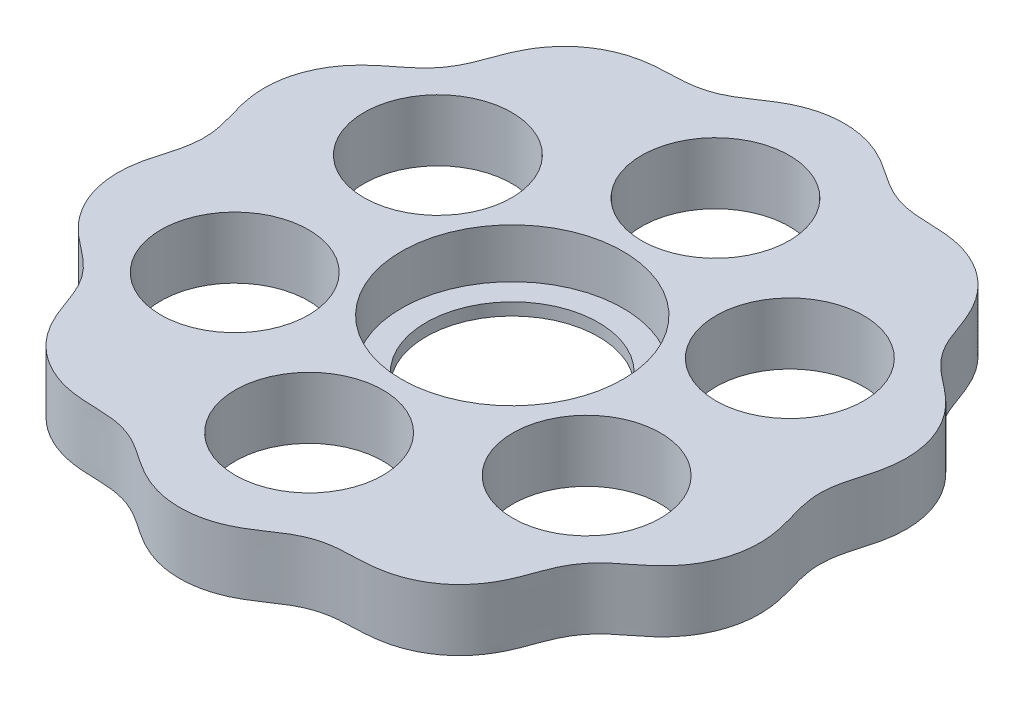
ISO-10303-21;
HEADER;
FILE_DESCRIPTION(('STEP AP214'),'2;1');
FILE_NAME('part.step','',(''),(''),'','','');
FILE_SCHEMA(('AUTOMOTIVE_DESIGN { 1 0 10303 214 1 1 1 1 }'));
ENDSEC;
DATA;
#1=APPLICATION_CONTEXT('core data for automotive mechanical design processes');
#2=APPLICATION_PROTOCOL_DEFINITION('international standard','automotive_design',2000,#1);
#3=PRODUCT_CONTEXT('',#1,'mechanical');
#4=PRODUCT('Part','Part','',(#3));
#5=PRODUCT_RELATED_PRODUCT_CATEGORY('part','',(#4));
#6=PRODUCT_DEFINITION_FORMATION('','',#4);
#7=PRODUCT_DEFINITION_CONTEXT('part definition',#1,'design');
#8=PRODUCT_DEFINITION('design','',#6,#7);
#9=PRODUCT_DEFINITION_SHAPE('','',#8);
#10=(LENGTH_UNIT() NAMED_UNIT(*) SI_UNIT(.MILLI.,.METRE.));
#11=(NAMED_UNIT(*) PLANE_ANGLE_UNIT() SI_UNIT($,.RADIAN.));
#12=(NAMED_UNIT(*) SI_UNIT($,.STERADIAN.) SOLID_ANGLE_UNIT());
#13=UNCERTAINTY_MEASURE_WITH_UNIT(LENGTH_MEASURE(1.E-05),#10,'distance_accuracy_value','');
#14=(GEOMETRIC_REPRESENTATION_CONTEXT(3) GLOBAL_UNCERTAINTY_ASSIGNED_CONTEXT((#13)) GLOBAL_UNIT_ASSIGNED_CONTEXT((#10,
#11,#12)) REPRESENTATION_CONTEXT('',''));
#15=CARTESIAN_POINT('',(0.,0.,0.));
#16=DIRECTION('',(0.,0.,1.));
#17=DIRECTION('',(1.,0.,0.));
#18=AXIS2_PLACEMENT_3D('',#15,#16,#17);
#19=CARTESIAN_POINT('',(25.0000043932119,5.,0.00688755630900068));
#20=CARTESIAN_POINT('',(25.0000079298728,5.,-0.0251789221813694));
#21=CARTESIAN_POINT('',(25.0006122124393,5.,-0.0894836878834096));
#22=CARTESIAN_POINT('',(25.0033137705583,5.,-0.21931083896127));
#23=CARTESIAN_POINT('',(25.0104733346177,5.,-0.378294162704438));
#24=CARTESIAN_POINT('',(25.023811139123,5.,-0.564866036945412));
#25=CARTESIAN_POINT('',(25.0466990496331,5.,-0.794074306736719));
#26=CARTESIAN_POINT('',(25.0830251590425,5.,-1.05906675390636));
#27=CARTESIAN_POINT('',(25.1366085348914,5.,-1.36011035681514));
#28=CARTESIAN_POINT('',(25.2007589711714,5.,-1.65913190132036));
#29=CARTESIAN_POINT('',(25.2736274349604,5.,-1.95606252800234));
#30=CARTESIAN_POINT('',(25.3578991143379,5.,-2.2693294773103));
#31=CARTESIAN_POINT('',(25.4520927934586,5.,-2.59913781536133));
#32=CARTESIAN_POINT('',(25.5799478649812,5.,-3.03757929360862));
#33=CARTESIAN_POINT('',(25.7089005682602,5.,-3.49511046296013));
#34=CARTESIAN_POINT('',(25.8233776615371,5.,-3.95665693120054));
#35=CARTESIAN_POINT('',(25.9354010299198,5.,-4.51608980350711));
#36=CARTESIAN_POINT('',(26.027439815781,5.,-5.14435756018011));
#37=CARTESIAN_POINT('',(26.076379782276,5.,-5.9382052774394));
#38=CARTESIAN_POINT('',(26.0229986373087,5.,-6.8924614789132));
#39=CARTESIAN_POINT('',(25.8327251169261,5.,-7.89472626132632));
#40=CARTESIAN_POINT('',(25.5115141079369,5.,-8.86304271895348));
#41=CARTESIAN_POINT('',(25.06501937879,5.,-9.78033108892347));
#42=CARTESIAN_POINT('',(24.52922665595,5.,-10.5901381652924));
#43=CARTESIAN_POINT('',(23.9328701508746,5.,-11.2923048087122));
#44=CARTESIAN_POINT('',(23.3042543809618,5.,-11.8958184569734));
#45=CARTESIAN_POINT('',(22.6697127632783,5.,-12.4183654838858));
#46=CARTESIAN_POINT('',(21.9507379783981,5.,-12.9659659988632));
#47=CARTESIAN_POINT('',(21.1795420958765,5.,-13.582577927403));
#48=CARTESIAN_POINT('',(20.3998279796656,5.,-14.3718541846484));
#49=CARTESIAN_POINT('',(19.7128923872484,5.,-15.3942954358269));
#50=CARTESIAN_POINT('',(19.1993715784081,5.,-16.5908852071694));
#51=CARTESIAN_POINT('',(18.7729722705069,5.,-17.8940312763662));
#52=CARTESIAN_POINT('',(18.1544684914808,5.,-19.3287567718172));
#53=CARTESIAN_POINT('',(17.1621794978166,5.,-20.7781573686578));
#54=CARTESIAN_POINT('',(15.7398390747472,5.,-22.0537516807593));
#55=CARTESIAN_POINT('',(14.166462825447,5.,-22.844224421919));
#56=CARTESIAN_POINT('',(12.7589848053442,5.,-23.2082945296998));
#57=CARTESIAN_POINT('',(11.6138654734049,5.,-23.3385309745854));
#58=CARTESIAN_POINT('',(10.7567981278104,5.,-23.3756646006657));
#59=CARTESIAN_POINT('',(9.84470001520157,5.,-23.3952060675215));
#60=CARTESIAN_POINT('',(8.87640804124759,5.,-23.4654385554486));
#61=CARTESIAN_POINT('',(7.77413068148992,5.,-23.691296055995));
#62=CARTESIAN_POINT('',(6.58733782639492,5.,-24.1819056906618));
#63=CARTESIAN_POINT('',(5.4707263460462,5.,-24.9196562346342));
#64=CARTESIAN_POINT('',(4.32883491321425,5.,-25.7245812925356));
#65=CARTESIAN_POINT('',(2.96464242008512,5.,-26.4507773450072));
#66=CARTESIAN_POINT('',(1.34690113740759,5.,-26.9526124886537));
#67=CARTESIAN_POINT('',(-0.529285396878028,5.,-27.0754503216001));
#68=CARTESIAN_POINT('',(-2.26247300825678,5.,-26.7246345850446));
#69=CARTESIAN_POINT('',(-3.60887890237826,5.,-26.1359390006047));
#70=CARTESIAN_POINT('',(-4.6137985842746,5.,-25.5258520456705));
#71=CARTESIAN_POINT('',(-5.34657526927802,5.,-25.0225056025051));
#72=CARTESIAN_POINT('',(-6.10855689305063,5.,-24.5060675721032));
#73=CARTESIAN_POINT('',(-6.94165519422261,5.,-24.037235359892));
#74=CARTESIAN_POINT('',(-7.99637903104393,5.,-23.6253306751136));
#75=CARTESIAN_POINT('',(-9.2881186621647,5.,-23.3871370814688));
#76=CARTESIAN_POINT('',(-10.6391705996122,5.,-23.3788682235266));
#77=CARTESIAN_POINT('',(-12.0367464501957,5.,-23.3156126748665));
#78=CARTESIAN_POINT('',(-13.5248730894135,5.,-23.0344523114824));
#79=CARTESIAN_POINT('',(-15.0463068951974,5.,-22.4448849132248));
#80=CARTESIAN_POINT('',(-16.5727332528975,5.,-21.400707194298));
#81=CARTESIAN_POINT('',(-17.8568330791975,5.,-19.8932545907739));
#82=CARTESIAN_POINT('',(-18.6989716168686,5.,-18.1945679186019));
#83=CARTESIAN_POINT('',(-19.1782318292762,5.,-16.6412968228826));
#84=CARTESIAN_POINT('',(-19.7262943259612,5.,-15.3760504107801));
#85=CARTESIAN_POINT('',(-20.4956197228332,5.,-14.2515956559399));
#86=CARTESIAN_POINT('',(-21.4539259408882,5.,-13.3044241102046));
#87=CARTESIAN_POINT('',(-22.5689001533263,5.,-12.5101623585405));
#88=CARTESIAN_POINT('',(-23.6404410661688,5.,-11.6087173178391));
#89=CARTESIAN_POINT('',(-24.6331361042316,5.,-10.4893617517088));
#90=CARTESIAN_POINT('',(-25.461092958498,5.,-9.12568495282608));
#91=CARTESIAN_POINT('',(-25.9545658313099,5.,-7.63087588252002));
#92=CARTESIAN_POINT('',(-26.1035053905357,5.,-6.10243469519284));
#93=CARTESIAN_POINT('',(-26.0122948948656,5.,-4.86952175427012));
#94=CARTESIAN_POINT('',(-25.8390620120504,5.,-3.9439520387487));
#95=CARTESIAN_POINT('',(-25.602654324425,5.,-3.07321832146391));
#96=CARTESIAN_POINT('',(-25.3527793271515,5.,-2.2470257291514));
#97=CARTESIAN_POINT('',(-25.1263181980435,5.,-1.37324821595767));
#98=CARTESIAN_POINT('',(-24.9868213370367,5.,-0.440454633070864));
#99=CARTESIAN_POINT('',(-24.9866946504391,5.,0.504309026434094));
#100=CARTESIAN_POINT('',(-25.1258818731271,5.,1.43714311047385));
#101=CARTESIAN_POINT('',(-25.3518907174907,5.,2.31103225307368));
#102=CARTESIAN_POINT('',(-25.6011161912943,5.,3.13742016008203));
#103=CARTESIAN_POINT('',(-25.8366342263414,5.,4.00839949319347));
#104=CARTESIAN_POINT('',(-26.0087985909375,5.,4.93416915368055));
#105=CARTESIAN_POINT('',(-26.0985167645958,5.,6.16719535175371));
#106=CARTESIAN_POINT('',(-25.9476888196573,5.,7.69544822216899));
#107=CARTESIAN_POINT('',(-25.452367735392,5.,9.1896511371411));
#108=CARTESIAN_POINT('',(-24.6227276155765,5.,10.5522955795275));
#109=CARTESIAN_POINT('',(-23.6286871547157,5.,11.6704637549174));
#110=CARTESIAN_POINT('',(-22.5561510845411,5.,12.5706830127468));
#111=CARTESIAN_POINT('',(-21.440599400345,5.,13.3641694997834));
#112=CARTESIAN_POINT('',(-20.481997665973,5.,14.3110671388792));
#113=CARTESIAN_POINT('',(-19.7123497830667,5.,15.4353023159605));
#114=CARTESIAN_POINT('',(-19.1638518787643,5.,16.7003253958562));
#115=CARTESIAN_POINT('',(-18.6832079070737,5.,18.253172317372));
#116=CARTESIAN_POINT('',(-17.8389889538979,5.,19.9508650695717));
#117=CARTESIAN_POINT('',(-16.5530471174498,5.,21.4567261032975));
#118=CARTESIAN_POINT('',(-15.0253163602825,5.,22.499019714024));
#119=CARTESIAN_POINT('',(-13.5031665384316,5.,23.0867028210544));
#120=CARTESIAN_POINT('',(-12.0147020408515,5.,23.3660907283626));
#121=CARTESIAN_POINT('',(-10.6170814454043,5.,23.4278342283776));
#122=CARTESIAN_POINT('',(-9.26600544961752,5.,23.4352845907441));
#123=CARTESIAN_POINT('',(-7.974178674783,5.,23.6731131848063));
#124=CARTESIAN_POINT('',(-6.91934814704455,5.,24.0847156081442));
#125=CARTESIAN_POINT('',(-6.0860726551769,5.,24.5532258308312));
#126=CARTESIAN_POINT('',(-5.32376952965237,5.,25.069175879905));
#127=CARTESIAN_POINT('',(-4.5905304256561,5.,25.5718569210931));
#128=CARTESIAN_POINT('',(-3.5849349866709,5.,26.1808384312395));
#129=CARTESIAN_POINT('',(-2.23780822383563,5.,26.7678994590057));
#130=CARTESIAN_POINT('',(-0.504188867643755,5.,27.1165725744601));
#131=CARTESIAN_POINT('',(1.37184417615121,5.,26.9914132889337));
#132=CARTESIAN_POINT('',(2.9889635777018,5.,26.4875871423835));
#133=CARTESIAN_POINT('',(4.35229283507073,5.,25.7597910349629));
#134=CARTESIAN_POINT('',(5.4933932662818,5.,24.9537642241872));
#135=CARTESIAN_POINT('',(6.60968027941226,5.,24.2154747450048));
#136=CARTESIAN_POINT('',(7.79634944193308,5.,23.7245423510175));
#137=CARTESIAN_POINT('',(8.89855249811723,5.,23.4983589305986));
#138=CARTESIAN_POINT('',(9.86680347830202,5.,23.4276732417533));
#139=CARTESIAN_POINT('',(10.7788845482796,5.,23.4074412946212));
#140=CARTESIAN_POINT('',(11.6359148270606,5.,23.36945169852));
#141=CARTESIAN_POINT('',(12.7808884439489,5.,23.2379110204094));
#142=CARTESIAN_POINT('',(14.1879233698284,5.,22.8721197497009));
#143=CARTESIAN_POINT('',(15.7603229206646,5.,22.0797025403663));
#144=CARTESIAN_POINT('',(17.181081282283,5.,20.802349348159));
#145=CARTESIAN_POINT('',(18.1715924312914,5.,19.3517340618197));
#146=CARTESIAN_POINT('',(18.7884346541148,5.,17.9163130922901));
#147=CARTESIAN_POINT('',(19.21375591678,5.,16.6128153070078));
#148=CARTESIAN_POINT('',(19.7268239416628,5.,15.4160034261703));
#149=CARTESIAN_POINT('',(20.4134858261717,5.,14.3933803082697));
#150=CARTESIAN_POINT('',(21.1929448365599,5.,13.6038616664718));
#151=CARTESIAN_POINT('',(21.9637930261875,5.,12.9868322613276));
#152=CARTESIAN_POINT('',(22.682305991833,5.,12.4386207126685));
#153=CARTESIAN_POINT('',(23.3162996417059,5.,11.9154066036533));
#154=CARTESIAN_POINT('',(23.9442189704372,5.,11.3111643061126));
#155=CARTESIAN_POINT('',(24.539726528131,5.,10.608276784118));
#156=CARTESIAN_POINT('',(25.0745247669077,5.,9.79781114548113));
#157=CARTESIAN_POINT('',(25.5198851969278,5.,8.87997212244043));
#158=CARTESIAN_POINT('',(25.8398996179583,5.,7.9112582171958));
#159=CARTESIAN_POINT('',(26.0289325219926,5.,6.90875995312277));
#160=CARTESIAN_POINT('',(26.0811434492348,5.,5.95443759676221));
#161=CARTESIAN_POINT('',(26.0252591693902,5.,5.06558658748466));
#162=CARTESIAN_POINT('',(25.9078796890771,5.,4.34461234412086));
#163=CARTESIAN_POINT('',(25.7812795077466,5.,3.78820958500266));
#164=CARTESIAN_POINT('',(25.6590868042047,5.,3.32880858055771));
#165=CARTESIAN_POINT('',(25.5547780407831,5.,2.96311511440138));
#166=CARTESIAN_POINT('',(25.4532508099249,5.,2.61602418954225));
#167=CARTESIAN_POINT('',(25.3588294879041,5.,2.28627637963999));
#168=CARTESIAN_POINT('',(25.2743680460886,5.,1.97306438742026));
#169=CARTESIAN_POINT('',(25.2013457004628,5.,1.67616833865605));
#170=CARTESIAN_POINT('',(25.1370607871719,5.,1.37717543122777));
#171=CARTESIAN_POINT('',(25.0833601037772,5.,1.0761515625969));
#172=CARTESIAN_POINT('',(25.0469423741083,5.,0.811169964321617));
#173=CARTESIAN_POINT('',(25.0239814226767,5.,0.581969133665082));
#174=CARTESIAN_POINT('',(25.0105867753964,5.,0.395412624954449));
#175=CARTESIAN_POINT('',(25.0033800775269,5.,0.236334122141992));
#176=CARTESIAN_POINT('',(25.0006407480401,5.,0.106713029741228));
#177=CARTESIAN_POINT('',(25.0000177303213,5.,0.0422874557302297));
#178=CARTESIAN_POINT('',(25.0000048774243,5.,0.0102208887561133));
#179=B_SPLINE_CURVE_WITH_KNOTS('',4,(#19,#20,#21,#22,#23,#24,#25,#26,#27,#28,#29,#30,#31,#32,
#33,#34,#35,#36,#37,#38,#39,#40,#41,#42,#43,#44,#45,#46,#47,#48,#49,#50,#51,#52,#53,#54,#55,#56,
#57,#58,#59,#60,#61,#62,#63,#64,#65,#66,#67,#68,#69,#70,#71,#72,#73,#74,#75,#76,#77,#78,#79,#80,
#81,#82,#83,#84,#85,#86,#87,#88,#89,#90,#91,#92,#93,#94,#95,#96,#97,#98,#99,#100,#101,#102,#103,
#104,#105,#106,#107,#108,#109,#110,#111,#112,#113,#114,#115,#116,#117,#118,#119,#120,#121,#122,
#123,#124,#125,#126,#127,#128,#129,#130,#131,#132,#133,#134,#135,#136,#137,#138,#139,#140,#141,
#142,#143,#144,#145,#146,#147,#148,#149,#150,#151,#152,#153,#154,#155,#156,#157,#158,#159,#160,
#161,#162,#163,#164,#165,#166,#167,#168,#169,#170,#171,#172,#173,#174,#175,#176,#177,#178),
.UNSPECIFIED.,.F.,.F.,(5,1,1,1,1,1,1,1,1,1,1,1,1,1,1,1,1,1,1,1,1,1,1,1,1,1,1,1,1,1,1,1,1,1,1,1,
1,1,1,1,1,1,1,1,1,1,1,1,1,1,1,1,1,1,1,1,1,1,1,1,1,1,1,1,1,1,1,1,1,1,1,1,1,1,1,1,1,1,1,1,1,1,1,1,
1,1,1,1,1,1,1,1,1,1,1,1,1,1,1,1,1,1,1,1,1,1,1,1,1,1,1,1,1,1,1,1,1,1,1,1,1,1,1,1,1,1,1,1,1,1,1,1,
1,1,1,1,1,1,1,1,1,1,1,1,1,1,1,1,1,1,1,1,1,1,1,1,5),(0.0804615197262434,0.0812161428674958,
0.0819707660087481,0.0827253891500004,0.0834800122912527,0.0849892585737573,0.086498504856262,
0.0880077511387667,0.0895169974212713,0.0910262437037759,0.0925354899862806,0.0944126974176467,
0.0962899048490129,0.100044319711745,0.101921527143111,0.103798734574477,0.10755314943721,
0.112574371415827,0.117595593394445,0.122617068797392,0.127638544200339,0.132659952271254,
0.137681360342169,0.141736286049243,0.145791211756316,0.149846137463389,0.153901063170462,
0.159587406004065,0.165273748837669,0.171662747529964,0.17805174622226,0.18520834029204,
0.19236493436182,0.202407301017102,0.212450102163112,0.222492598790073,0.226723993407036,
0.230955388023999,0.235186782640962,0.239418177257925,0.24475244335888,0.250086709459835,
0.257327181229622,0.264567652999408,0.271122460810145,0.277677268620881,0.28772011413719,
0.297762624507916,0.307804989090352,0.312191215863177,0.316577442636001,0.320963669408826,
0.325349896181651,0.330375172349953,0.335400448518255,0.343242122460941,0.351083796403628,
0.357036678505898,0.362989560608168,0.373032437073226,0.383075638505885,0.393117634059954,
0.401639943906908,0.410162253753863,0.415187630773478,0.420213007793094,0.428406086903418,
0.436599166013741,0.442200502945815,0.447801839877889,0.457844221094493,0.467886802773057,
0.472907762747938,0.477928722722819,0.482190507901121,0.486452293079423,0.490714078257725,
0.494975863436027,0.499999794893339,0.505023726350651,0.509285511883305,0.513547297415958,
0.517809082948612,0.522070868481265,0.52709182174304,0.532112775004816,0.542155364247279,
0.552197736865907,0.557799075866214,0.563400414866522,0.571593502195967,0.579786589525413,
0.584811961319672,0.58983733311393,0.5983596388102,0.60688194450647,0.616923945629532,
0.626967147713695,0.637010030524175,0.642962908030616,0.648915785537056,0.656757468191927,
0.664599150846798,0.669624415315287,0.674649679783776,0.679035910021745,0.683422140259713,
0.687808370497682,0.69219460073565,0.702236964149607,0.71227947215246,0.722322312143903,
0.728877119635601,0.735431927127298,0.742672407990715,0.749912888854132,0.755247161799228,
0.760581434744325,0.764812818920013,0.769044203095701,0.773275587271389,0.777506971447078,
0.787549477273022,0.797592285784538,0.807634641086699,0.814791236355581,0.821947831624462,
0.828336838181949,0.834725844739436,0.840412181124389,0.846098517509343,0.850153443742022,
0.854208369974702,0.858263296207381,0.862318222440061,0.8673396306057,0.872361038771338,
0.877382515042907,0.882403991314475,0.887425215934957,0.892446440555439,0.896200845358665,
0.89995525016189,0.901832452563503,0.903709654965115,0.905586857366728,0.907464059768341,
0.908973310327308,0.910482560886275,0.911991811445242,0.91350106200421,0.915010312563177,
0.916519563122144,0.917274188401628,0.918028813681111,0.918783438960595,0.919538064240079),.UNSPECIFIED.);
#180=DIRECTION('',(0.,-1.,0.));
#181=VECTOR('',#180,1.);
#182=SURFACE_OF_LINEAR_EXTRUSION('',#179,#181);
#183=CARTESIAN_POINT('',(25.0000043932119,0.,0.00688755630900068));
#184=CARTESIAN_POINT('',(25.0000079298728,0.,-0.0251789221813694));
#185=CARTESIAN_POINT('',(25.0006122124393,0.,-0.0894836878834096));
#186=CARTESIAN_POINT('',(25.0033137705583,0.,-0.21931083896127));
#187=CARTESIAN_POINT('',(25.0104733346177,0.,-0.378294162704438));
#188=CARTESIAN_POINT('',(25.023811139123,0.,-0.564866036945412));
#189=CARTESIAN_POINT('',(25.0466990496331,0.,-0.794074306736719));
#190=CARTESIAN_POINT('',(25.0830251590425,0.,-1.05906675390636));
#191=CARTESIAN_POINT('',(25.1366085348914,0.,-1.36011035681514));
#192=CARTESIAN_POINT('',(25.2007589711714,0.,-1.65913190132036));
#193=CARTESIAN_POINT('',(25.2736274349604,0.,-1.95606252800234));
#194=CARTESIAN_POINT('',(25.3578991143379,0.,-2.2693294773103));
#195=CARTESIAN_POINT('',(25.4520927934586,0.,-2.59913781536133));
#196=CARTESIAN_POINT('',(25.5799478649812,0.,-3.03757929360862));
#197=CARTESIAN_POINT('',(25.7089005682602,0.,-3.49511046296013));
#198=CARTESIAN_POINT('',(25.8233776615371,0.,-3.95665693120054));
#199=CARTESIAN_POINT('',(25.9354010299198,0.,-4.51608980350711));
#200=CARTESIAN_POINT('',(26.027439815781,0.,-5.14435756018011));
#201=CARTESIAN_POINT('',(26.076379782276,0.,-5.9382052774394));
#202=CARTESIAN_POINT('',(26.0229986373087,0.,-6.8924614789132));
#203=CARTESIAN_POINT('',(25.8327251169261,0.,-7.89472626132632));
#204=CARTESIAN_POINT('',(25.5115141079369,0.,-8.86304271895348));
#205=CARTESIAN_POINT('',(25.06501937879,0.,-9.78033108892347));
#206=CARTESIAN_POINT('',(24.52922665595,0.,-10.5901381652924));
#207=CARTESIAN_POINT('',(23.9328701508746,0.,-11.2923048087122));
#208=CARTESIAN_POINT('',(23.3042543809618,0.,-11.8958184569734));
#209=CARTESIAN_POINT('',(22.6697127632783,0.,-12.4183654838858));
#210=CARTESIAN_POINT('',(21.9507379783981,0.,-12.9659659988632));
#211=CARTESIAN_POINT('',(21.1795420958765,0.,-13.582577927403));
#212=CARTESIAN_POINT('',(20.3998279796656,0.,-14.3718541846484));
#213=CARTESIAN_POINT('',(19.7128923872484,0.,-15.3942954358269));
#214=CARTESIAN_POINT('',(19.1993715784081,0.,-16.5908852071694));
#215=CARTESIAN_POINT('',(18.7729722705069,0.,-17.8940312763662));
#216=CARTESIAN_POINT('',(18.1544684914808,0.,-19.3287567718172));
#217=CARTESIAN_POINT('',(17.1621794978166,0.,-20.7781573686578));
#218=CARTESIAN_POINT('',(15.7398390747472,0.,-22.0537516807593));
#219=CARTESIAN_POINT('',(14.166462825447,0.,-22.844224421919));
#220=CARTESIAN_POINT('',(12.7589848053442,0.,-23.2082945296998));
#221=CARTESIAN_POINT('',(11.6138654734049,0.,-23.3385309745854));
#222=CARTESIAN_POINT('',(10.7567981278104,0.,-23.3756646006657));
#223=CARTESIAN_POINT('',(9.84470001520157,0.,-23.3952060675215));
#224=CARTESIAN_POINT('',(8.87640804124759,0.,-23.4654385554486));
#225=CARTESIAN_POINT('',(7.77413068148992,0.,-23.691296055995));
#226=CARTESIAN_POINT('',(6.58733782639492,0.,-24.1819056906618));
#227=CARTESIAN_POINT('',(5.4707263460462,0.,-24.9196562346342));
#228=CARTESIAN_POINT('',(4.32883491321425,0.,-25.7245812925356));
#229=CARTESIAN_POINT('',(2.96464242008512,0.,-26.4507773450072));
#230=CARTESIAN_POINT('',(1.34690113740759,0.,-26.9526124886537));
#231=CARTESIAN_POINT('',(-0.529285396878028,0.,-27.0754503216001));
#232=CARTESIAN_POINT('',(-2.26247300825678,0.,-26.7246345850446));
#233=CARTESIAN_POINT('',(-3.60887890237826,0.,-26.1359390006047));
#234=CARTESIAN_POINT('',(-4.6137985842746,0.,-25.5258520456705));
#235=CARTESIAN_POINT('',(-5.34657526927802,0.,-25.0225056025051));
#236=CARTESIAN_POINT('',(-6.10855689305063,0.,-24.5060675721032));
#237=CARTESIAN_POINT('',(-6.94165519422261,0.,-24.037235359892));
#238=CARTESIAN_POINT('',(-7.99637903104393,0.,-23.6253306751136));
#239=CARTESIAN_POINT('',(-9.2881186621647,0.,-23.3871370814688));
#240=CARTESIAN_POINT('',(-10.6391705996122,0.,-23.3788682235266));
#241=CARTESIAN_POINT('',(-12.0367464501957,0.,-23.3156126748665));
#242=CARTESIAN_POINT('',(-13.5248730894135,0.,-23.0344523114824));
#243=CARTESIAN_POINT('',(-15.0463068951974,0.,-22.4448849132248));
#244=CARTESIAN_POINT('',(-16.5727332528975,0.,-21.400707194298));
#245=CARTESIAN_POINT('',(-17.8568330791975,0.,-19.8932545907739));
#246=CARTESIAN_POINT('',(-18.6989716168686,0.,-18.1945679186019));
#247=CARTESIAN_POINT('',(-19.1782318292762,0.,-16.6412968228826));
#248=CARTESIAN_POINT('',(-19.7262943259612,0.,-15.3760504107801));
#249=CARTESIAN_POINT('',(-20.4956197228332,0.,-14.2515956559399));
#250=CARTESIAN_POINT('',(-21.4539259408882,0.,-13.3044241102046));
#251=CARTESIAN_POINT('',(-22.5689001533263,0.,-12.5101623585405));
#252=CARTESIAN_POINT('',(-23.6404410661688,0.,-11.6087173178391));
#253=CARTESIAN_POINT('',(-24.6331361042316,0.,-10.4893617517088));
#254=CARTESIAN_POINT('',(-25.461092958498,0.,-9.12568495282608));
#255=CARTESIAN_POINT('',(-25.9545658313099,0.,-7.63087588252002));
#256=CARTESIAN_POINT('',(-26.1035053905357,0.,-6.10243469519284));
#257=CARTESIAN_POINT('',(-26.0122948948656,0.,-4.86952175427012));
#258=CARTESIAN_POINT('',(-25.8390620120504,0.,-3.9439520387487));
#259=CARTESIAN_POINT('',(-25.602654324425,0.,-3.07321832146391));
#260=CARTESIAN_POINT('',(-25.3527793271515,0.,-2.2470257291514));
#261=CARTESIAN_POINT('',(-25.1263181980435,0.,-1.37324821595767));
#262=CARTESIAN_POINT('',(-24.9868213370367,0.,-0.440454633070864));
#263=CARTESIAN_POINT('',(-24.9866946504391,0.,0.504309026434094));
#264=CARTESIAN_POINT('',(-25.1258818731271,0.,1.43714311047385));
#265=CARTESIAN_POINT('',(-25.3518907174907,0.,2.31103225307368));
#266=CARTESIAN_POINT('',(-25.6011161912943,0.,3.13742016008203));
#267=CARTESIAN_POINT('',(-25.8366342263414,0.,4.00839949319347));
#268=CARTESIAN_POINT('',(-26.0087985909375,0.,4.93416915368055));
#269=CARTESIAN_POINT('',(-26.0985167645958,0.,6.16719535175371));
#270=CARTESIAN_POINT('',(-25.9476888196573,0.,7.69544822216899));
#271=CARTESIAN_POINT('',(-25.452367735392,0.,9.1896511371411));
#272=CARTESIAN_POINT('',(-24.6227276155765,0.,10.5522955795275));
#273=CARTESIAN_POINT('',(-23.6286871547157,0.,11.6704637549174));
#274=CARTESIAN_POINT('',(-22.5561510845411,0.,12.5706830127468));
#275=CARTESIAN_POINT('',(-21.440599400345,0.,13.3641694997834));
#276=CARTESIAN_POINT('',(-20.481997665973,0.,14.3110671388792));
#277=CARTESIAN_POINT('',(-19.7123497830667,0.,15.4353023159605));
#278=CARTESIAN_POINT('',(-19.1638518787643,0.,16.7003253958562));
#279=CARTESIAN_POINT('',(-18.6832079070737,0.,18.253172317372));
#280=CARTESIAN_POINT('',(-17.8389889538979,0.,19.9508650695717));
#281=CARTESIAN_POINT('',(-16.5530471174498,0.,21.4567261032975));
#282=CARTESIAN_POINT('',(-15.0253163602825,0.,22.499019714024));
#283=CARTESIAN_POINT('',(-13.5031665384316,0.,23.0867028210544));
#284=CARTESIAN_POINT('',(-12.0147020408515,0.,23.3660907283626));
#285=CARTESIAN_POINT('',(-10.6170814454043,0.,23.4278342283776));
#286=CARTESIAN_POINT('',(-9.26600544961752,0.,23.4352845907441));
#287=CARTESIAN_POINT('',(-7.974178674783,0.,23.6731131848063));
#288=CARTESIAN_POINT('',(-6.91934814704455,0.,24.0847156081442));
#289=CARTESIAN_POINT('',(-6.0860726551769,0.,24.5532258308312));
#290=CARTESIAN_POINT('',(-5.32376952965237,0.,25.069175879905));
#291=CARTESIAN_POINT('',(-4.5905304256561,0.,25.5718569210931));
#292=CARTESIAN_POINT('',(-3.5849349866709,0.,26.1808384312395));
#293=CARTESIAN_POINT('',(-2.23780822383563,0.,26.7678994590057));
#294=CARTESIAN_POINT('',(-0.504188867643755,0.,27.1165725744601));
#295=CARTESIAN_POINT('',(1.37184417615121,0.,26.9914132889337));
#296=CARTESIAN_POINT('',(2.9889635777018,0.,26.4875871423835));
#297=CARTESIAN_POINT('',(4.35229283507073,0.,25.7597910349629));
#298=CARTESIAN_POINT('',(5.4933932662818,0.,24.9537642241872));
#299=CARTESIAN_POINT('',(6.60968027941226,0.,24.2154747450048));
#300=CARTESIAN_POINT('',(7.79634944193308,0.,23.7245423510175));
#301=CARTESIAN_POINT('',(8.89855249811723,0.,23.4983589305986));
#302=CARTESIAN_POINT('',(9.86680347830202,0.,23.4276732417533));
#303=CARTESIAN_POINT('',(10.7788845482796,0.,23.4074412946212));
#304=CARTESIAN_POINT('',(11.6359148270606,0.,23.36945169852));
#305=CARTESIAN_POINT('',(12.7808884439489,0.,23.2379110204094));
#306=CARTESIAN_POINT('',(14.1879233698284,0.,22.8721197497009));
#307=CARTESIAN_POINT('',(15.7603229206646,0.,22.0797025403663));
#308=CARTESIAN_POINT('',(17.181081282283,0.,20.802349348159));
#309=CARTESIAN_POINT('',(18.1715924312914,0.,19.3517340618197));
#310=CARTESIAN_POINT('',(18.7884346541148,0.,17.9163130922901));
#311=CARTESIAN_POINT('',(19.21375591678,0.,16.6128153070078));
#312=CARTESIAN_POINT('',(19.7268239416628,0.,15.4160034261703));
#313=CARTESIAN_POINT('',(20.4134858261717,0.,14.3933803082697));
#314=CARTESIAN_POINT('',(21.1929448365599,0.,13.6038616664718));
#315=CARTESIAN_POINT('',(21.9637930261875,0.,12.9868322613276));
#316=CARTESIAN_POINT('',(22.682305991833,0.,12.4386207126685));
#317=CARTESIAN_POINT('',(23.3162996417059,0.,11.9154066036533));
#318=CARTESIAN_POINT('',(23.9442189704372,0.,11.3111643061126));
#319=CARTESIAN_POINT('',(24.539726528131,0.,10.608276784118));
#320=CARTESIAN_POINT('',(25.0745247669077,0.,9.79781114548113));
#321=CARTESIAN_POINT('',(25.5198851969278,0.,8.87997212244043));
#322=CARTESIAN_POINT('',(25.8398996179583,0.,7.9112582171958));
#323=CARTESIAN_POINT('',(26.0289325219926,0.,6.90875995312277));
#324=CARTESIAN_POINT('',(26.0811434492348,0.,5.95443759676221));
#325=CARTESIAN_POINT('',(26.0252591693902,0.,5.06558658748466));
#326=CARTESIAN_POINT('',(25.9078796890771,0.,4.34461234412086));
#327=CARTESIAN_POINT('',(25.7812795077466,0.,3.78820958500266));
#328=CARTESIAN_POINT('',(25.6590868042047,0.,3.32880858055771));
#329=CARTESIAN_POINT('',(25.5547780407831,0.,2.96311511440138));
#330=CARTESIAN_POINT('',(25.4532508099249,0.,2.61602418954225));
#331=CARTESIAN_POINT('',(25.3588294879041,0.,2.28627637963999));
#332=CARTESIAN_POINT('',(25.2743680460886,0.,1.97306438742026));
#333=CARTESIAN_POINT('',(25.2013457004628,0.,1.67616833865605));
#334=CARTESIAN_POINT('',(25.1370607871719,0.,1.37717543122777));
#335=CARTESIAN_POINT('',(25.0833601037772,0.,1.0761515625969));
#336=CARTESIAN_POINT('',(25.0469423741083,0.,0.811169964321617));
#337=CARTESIAN_POINT('',(25.0239814226767,0.,0.581969133665082));
#338=CARTESIAN_POINT('',(25.0105867753964,0.,0.395412624954449));
#339=CARTESIAN_POINT('',(25.0033800775269,0.,0.236334122141992));
#340=CARTESIAN_POINT('',(25.0006407480401,0.,0.106713029741228));
#341=CARTESIAN_POINT('',(25.0000177303213,0.,0.0422874557302297));
#342=CARTESIAN_POINT('',(25.0000048774243,0.,0.0102208887561133));
#343=B_SPLINE_CURVE_WITH_KNOTS('',4,(#183,#184,#185,#186,#187,#188,#189,#190,#191,#192,#193,
#194,#195,#196,#197,#198,#199,#200,#201,#202,#203,#204,#205,#206,#207,#208,#209,#210,#211,#212,
#213,#214,#215,#216,#217,#218,#219,#220,#221,#222,#223,#224,#225,#226,#227,#228,#229,#230,#231,
#232,#233,#234,#235,#236,#237,#238,#239,#240,#241,#242,#243,#244,#245,#246,#247,#248,#249,#250,
#251,#252,#253,#254,#255,#256,#257,#258,#259,#260,#261,#262,#263,#264,#265,#266,#267,#268,#269,
#270,#271,#272,#273,#274,#275,#276,#277,#278,#279,#280,#281,#282,#283,#284,#285,#286,#287,#288,
#289,#290,#291,#292,#293,#294,#295,#296,#297,#298,#299,#300,#301,#302,#303,#304,#305,#306,#307,
#308,#309,#310,#311,#312,#313,#314,#315,#316,#317,#318,#319,#320,#321,#322,#323,#324,#325,#326,
#327,#328,#329,#330,#331,#332,#333,#334,#335,#336,#337,#338,#339,#340,#341,#342),.UNSPECIFIED.,
.F.,.F.,(5,1,1,1,1,1,1,1,1,1,1,1,1,1,1,1,1,1,1,1,1,1,1,1,1,1,1,1,1,1,1,1,1,1,1,1,1,1,1,1,1,1,1,
1,1,1,1,1,1,1,1,1,1,1,1,1,1,1,1,1,1,1,1,1,1,1,1,1,1,1,1,1,1,1,1,1,1,1,1,1,1,1,1,1,1,1,1,1,1,1,1,
1,1,1,1,1,1,1,1,1,1,1,1,1,1,1,1,1,1,1,1,1,1,1,1,1,1,1,1,1,1,1,1,1,1,1,1,1,1,1,1,1,1,1,1,1,1,1,1,
1,1,1,1,1,1,1,1,1,1,1,1,1,1,1,1,1,5),(0.0804615197262434,0.0812161428674958,0.0819707660087481,
0.0827253891500004,0.0834800122912527,0.0849892585737573,0.086498504856262,0.0880077511387667,
0.0895169974212713,0.0910262437037759,0.0925354899862806,0.0944126974176467,0.0962899048490129,
0.100044319711745,0.101921527143111,0.103798734574477,0.10755314943721,0.112574371415827,
0.117595593394445,0.122617068797392,0.127638544200339,0.132659952271254,0.137681360342169,
0.141736286049243,0.145791211756316,0.149846137463389,0.153901063170462,0.159587406004065,
0.165273748837669,0.171662747529964,0.17805174622226,0.18520834029204,0.19236493436182,
0.202407301017102,0.212450102163112,0.222492598790073,0.226723993407036,0.230955388023999,
0.235186782640962,0.239418177257925,0.24475244335888,0.250086709459835,0.257327181229622,
0.264567652999408,0.271122460810145,0.277677268620881,0.28772011413719,0.297762624507916,
0.307804989090352,0.312191215863177,0.316577442636001,0.320963669408826,0.325349896181651,
0.330375172349953,0.335400448518255,0.343242122460941,0.351083796403628,0.357036678505898,
0.362989560608168,0.373032437073226,0.383075638505885,0.393117634059954,0.401639943906908,
0.410162253753863,0.415187630773478,0.420213007793094,0.428406086903418,0.436599166013741,
0.442200502945815,0.447801839877889,0.457844221094493,0.467886802773057,0.472907762747938,
0.477928722722819,0.482190507901121,0.486452293079423,0.490714078257725,0.494975863436027,
0.499999794893339,0.505023726350651,0.509285511883305,0.513547297415958,0.517809082948612,
0.522070868481265,0.52709182174304,0.532112775004816,0.542155364247279,0.552197736865907,
0.557799075866214,0.563400414866522,0.571593502195967,0.579786589525413,0.584811961319672,
0.58983733311393,0.5983596388102,0.60688194450647,0.616923945629532,0.626967147713695,
0.637010030524175,0.642962908030616,0.648915785537056,0.656757468191927,0.664599150846798,
0.669624415315287,0.674649679783776,0.679035910021745,0.683422140259713,0.687808370497682,
0.69219460073565,0.702236964149607,0.71227947215246,0.722322312143903,0.728877119635601,
0.735431927127298,0.742672407990715,0.749912888854132,0.755247161799228,0.760581434744325,
0.764812818920013,0.769044203095701,0.773275587271389,0.777506971447078,0.787549477273022,
0.797592285784538,0.807634641086699,0.814791236355581,0.821947831624462,0.828336838181949,
0.834725844739436,0.840412181124389,0.846098517509343,0.850153443742022,0.854208369974702,
0.858263296207381,0.862318222440061,0.8673396306057,0.872361038771338,0.877382515042907,
0.882403991314475,0.887425215934957,0.892446440555439,0.896200845358665,0.89995525016189,
0.901832452563503,0.903709654965115,0.905586857366728,0.907464059768341,0.908973310327308,
0.910482560886275,0.911991811445242,0.91350106200421,0.915010312563177,0.916519563122144,
0.917274188401628,0.918028813681111,0.918783438960595,0.919538064240079),.UNSPECIFIED.);
#344=CARTESIAN_POINT('',(25.0000043932119,0.,0.00688755630896293));
#345=VERTEX_POINT('',#344);
#346=CARTESIAN_POINT('',(25.0000048774243,0.,0.0102208887601186));
#347=VERTEX_POINT('',#346);
#348=EDGE_CURVE('E67',#345,#347,#343,.T.);
#349=ORIENTED_EDGE('',*,*,#348,.T.);
#350=DIRECTION('',(0.,-1.,0.));
#351=VECTOR('',#350,1.);
#352=CARTESIAN_POINT('',(25.0000048774243,5.,0.0102208887601186));
#353=LINE('',#352,#351);
#354=CARTESIAN_POINT('',(25.0000048774243,5.,0.0102208887601186));
#355=VERTEX_POINT('',#354);
#356=EDGE_CURVE('E11',#355,#347,#353,.T.);
#357=ORIENTED_EDGE('',*,*,#356,.F.);
#358=CARTESIAN_POINT('',(25.0000043932119,5.,0.00688755630896293));
#359=VERTEX_POINT('',#358);
#360=EDGE_CURVE('E66',#359,#355,#179,.T.);
#361=ORIENTED_EDGE('',*,*,#360,.F.);
#362=DIRECTION('',(0.,-1.,0.));
#363=VECTOR('',#362,1.);
#364=CARTESIAN_POINT('',(25.0000043932119,5.,0.00688755630896293));
#365=LINE('',#364,#363);
#366=EDGE_CURVE('E44',#359,#345,#365,.T.);
#367=ORIENTED_EDGE('',*,*,#366,.T.);
#368=EDGE_LOOP('',(#349,#357,#361,#367));
#369=FACE_BOUND('',#368,.T.);
#370=ADVANCED_FACE('F34',(#369),#182,.F.);
#371=CARTESIAN_POINT('',(25.0000043932119,5.,0.00688755630896293));
#372=DIRECTION('',(-0.999999989449217,0.,0.000145263778572354));
#373=DIRECTION('',(0.000145263778572354,0.,0.999999989449217));
#374=AXIS2_PLACEMENT_3D('',#371,#372,#373);
#375=PLANE('',#374);
#376=DIRECTION('',(-0.000145263778572354,0.,-0.999999989449217));
#377=VECTOR('',#376,1.);
#378=CARTESIAN_POINT('',(25.0000043932119,0.,0.00688755630896293));
#379=LINE('',#378,#377);
#380=EDGE_CURVE('E59',#347,#345,#379,.T.);
#381=ORIENTED_EDGE('',*,*,#380,.T.);
#382=ORIENTED_EDGE('',*,*,#366,.F.);
#383=DIRECTION('',(-0.000145263778572354,0.,-0.999999989449217));
#384=VECTOR('',#383,1.);
#385=CARTESIAN_POINT('',(25.0000043932119,5.,0.00688755630896293));
#386=LINE('',#385,#384);
#387=EDGE_CURVE('E51',#355,#359,#386,.T.);
#388=ORIENTED_EDGE('',*,*,#387,.F.);
#389=ORIENTED_EDGE('',*,*,#356,.T.);
#390=EDGE_LOOP('',(#381,#382,#388,#389));
#391=FACE_BOUND('',#390,.T.);
#392=ADVANCED_FACE('F62',(#391),#375,.F.);
#393=CARTESIAN_POINT('',(-24.999992117592,5.,0.0319285197518447));
#394=DIRECTION('',(0.,-1.,0.));
#395=DIRECTION('',(0.,0.,-1.));
#396=AXIS2_PLACEMENT_3D('',#393,#394,#395);
#397=PLANE('',#396);
#398=CARTESIAN_POINT('',(14.2894191624434,5.,-8.24999999999977));
#399=DIRECTION('',(0.,1.,0.));
#400=DIRECTION('',(0.,0.,1.));
#401=AXIS2_PLACEMENT_3D('',#398,#399,#400);
#402=CIRCLE('',#401,6.);
#403=CARTESIAN_POINT('',(14.2894191624434,5.,-2.24999999999977));
#404=VERTEX_POINT('',#403);
#405=EDGE_CURVE('E121',#404,#404,#402,.T.);
#406=ORIENTED_EDGE('',*,*,#405,.F.);
#407=EDGE_LOOP('',(#406));
#408=FACE_BOUND('',#407,.T.);
#409=CARTESIAN_POINT('',(14.2894191624431,5.,8.25000000000028));
#410=DIRECTION('',(0.,1.,0.));
#411=DIRECTION('',(0.,0.,1.));
#412=AXIS2_PLACEMENT_3D('',#409,#410,#411);
#413=CIRCLE('',#412,6.);
#414=CARTESIAN_POINT('',(14.2894191624431,5.,14.2500000000003));
#415=VERTEX_POINT('',#414);
#416=EDGE_CURVE('E115',#415,#415,#413,.T.);
#417=ORIENTED_EDGE('',*,*,#416,.F.);
#418=EDGE_LOOP('',(#417));
#419=FACE_BOUND('',#418,.T.);
#420=CARTESIAN_POINT('',(-3.41740524767431E-13,5.,16.5));
#421=DIRECTION('',(0.,1.,0.));
#422=DIRECTION('',(0.,0.,1.));
#423=AXIS2_PLACEMENT_3D('',#420,#421,#422);
#424=CIRCLE('',#423,6.);
#425=CARTESIAN_POINT('',(-3.41740524767431E-13,5.,22.5));
#426=VERTEX_POINT('',#425);
#427=EDGE_CURVE('E109',#426,#426,#424,.T.);
#428=ORIENTED_EDGE('',*,*,#427,.F.);
#429=EDGE_LOOP('',(#428));
#430=FACE_BOUND('',#429,.T.);
#431=CARTESIAN_POINT('',(-14.2894191624433,5.,8.24999999999987));
#432=DIRECTION('',(0.,1.,0.));
#433=DIRECTION('',(0.,0.,1.));
#434=AXIS2_PLACEMENT_3D('',#431,#432,#433);
#435=CIRCLE('',#434,6.);
#436=CARTESIAN_POINT('',(-14.2894191624433,5.,14.2499999999999));
#437=VERTEX_POINT('',#436);
#438=EDGE_CURVE('E102',#437,#437,#435,.T.);
#439=ORIENTED_EDGE('',*,*,#438,.F.);
#440=EDGE_LOOP('',(#439));
#441=FACE_BOUND('',#440,.T.);
#442=CARTESIAN_POINT('',(-14.2894191624431,5.,-8.25000000000016));
#443=DIRECTION('',(0.,1.,0.));
#444=DIRECTION('',(0.,0.,1.));
#445=AXIS2_PLACEMENT_3D('',#442,#443,#444);
#446=CIRCLE('',#445,6.);
#447=CARTESIAN_POINT('',(-14.2894191624431,5.,-2.25000000000016));
#448=VERTEX_POINT('',#447);
#449=EDGE_CURVE('E126',#448,#448,#446,.T.);
#450=ORIENTED_EDGE('',*,*,#449,.F.);
#451=EDGE_LOOP('',(#450));
#452=FACE_BOUND('',#451,.T.);
#453=CARTESIAN_POINT('',(0.,5.,-16.5));
#454=DIRECTION('',(0.,1.,0.));
#455=DIRECTION('',(0.,0.,1.));
#456=AXIS2_PLACEMENT_3D('',#453,#454,#455);
#457=CIRCLE('',#456,6.);
#458=CARTESIAN_POINT('',(0.,5.,-10.5));
#459=VERTEX_POINT('',#458);
#460=EDGE_CURVE('E96',#459,#459,#457,.T.);
#461=ORIENTED_EDGE('',*,*,#460,.F.);
#462=EDGE_LOOP('',(#461));
#463=FACE_BOUND('',#462,.T.);
#464=CARTESIAN_POINT('',(0.,5.,0.));
#465=DIRECTION('',(0.,1.,0.));
#466=DIRECTION('',(0.,0.,1.));
#467=AXIS2_PLACEMENT_3D('',#464,#465,#466);
#468=CIRCLE('',#467,9.);
#469=CARTESIAN_POINT('',(0.,5.,9.));
#470=VERTEX_POINT('',#469);
#471=EDGE_CURVE('E75',#470,#470,#468,.T.);
#472=ORIENTED_EDGE('',*,*,#471,.F.);
#473=EDGE_LOOP('',(#472));
#474=FACE_BOUND('',#473,.T.);
#475=ORIENTED_EDGE('',*,*,#360,.T.);
#476=ORIENTED_EDGE('',*,*,#387,.T.);
#477=EDGE_LOOP('',(#475,#476));
#478=FACE_BOUND('',#477,.T.);
#479=ADVANCED_FACE('F142',(#408,#419,#430,#441,#452,#463,#474,#478),#397,.F.);
#480=CARTESIAN_POINT('',(-24.999992117592,0.,0.0319285197518447));
#481=DIRECTION('',(0.,-1.,0.));
#482=DIRECTION('',(0.,0.,-1.));
#483=AXIS2_PLACEMENT_3D('',#480,#481,#482);
#484=PLANE('',#483);
#485=CARTESIAN_POINT('',(14.2894191624434,0.,-8.24999999999977));
#486=DIRECTION('',(0.,1.,0.));
#487=DIRECTION('',(0.,0.,1.));
#488=AXIS2_PLACEMENT_3D('',#485,#486,#487);
#489=CIRCLE('',#488,6.);
#490=CARTESIAN_POINT('',(14.2894191624434,0.,-2.24999999999977));
#491=VERTEX_POINT('',#490);
#492=EDGE_CURVE('E99',#491,#491,#489,.T.);
#493=ORIENTED_EDGE('',*,*,#492,.T.);
#494=EDGE_LOOP('',(#493));
#495=FACE_BOUND('',#494,.T.);
#496=CARTESIAN_POINT('',(14.2894191624431,0.,8.25000000000028));
#497=DIRECTION('',(0.,1.,0.));
#498=DIRECTION('',(0.,0.,1.));
#499=AXIS2_PLACEMENT_3D('',#496,#497,#498);
#500=CIRCLE('',#499,6.);
#501=CARTESIAN_POINT('',(14.2894191624431,0.,14.2500000000003));
#502=VERTEX_POINT('',#501);
#503=EDGE_CURVE('E118',#502,#502,#500,.T.);
#504=ORIENTED_EDGE('',*,*,#503,.T.);
#505=EDGE_LOOP('',(#504));
#506=FACE_BOUND('',#505,.T.);
#507=CARTESIAN_POINT('',(-3.41740524767431E-13,0.,16.5));
#508=DIRECTION('',(0.,1.,0.));
#509=DIRECTION('',(0.,0.,1.));
#510=AXIS2_PLACEMENT_3D('',#507,#508,#509);
#511=CIRCLE('',#510,6.);
#512=CARTESIAN_POINT('',(-3.41740524767431E-13,0.,22.5));
#513=VERTEX_POINT('',#512);
#514=EDGE_CURVE('E112',#513,#513,#511,.T.);
#515=ORIENTED_EDGE('',*,*,#514,.T.);
#516=EDGE_LOOP('',(#515));
#517=FACE_BOUND('',#516,.T.);
#518=CARTESIAN_POINT('',(-14.2894191624433,0.,8.24999999999987));
#519=DIRECTION('',(0.,1.,0.));
#520=DIRECTION('',(0.,0.,1.));
#521=AXIS2_PLACEMENT_3D('',#518,#519,#520);
#522=CIRCLE('',#521,6.);
#523=CARTESIAN_POINT('',(-14.2894191624433,0.,14.2499999999999));
#524=VERTEX_POINT('',#523);
#525=EDGE_CURVE('E105',#524,#524,#522,.T.);
#526=ORIENTED_EDGE('',*,*,#525,.T.);
#527=EDGE_LOOP('',(#526));
#528=FACE_BOUND('',#527,.T.);
#529=CARTESIAN_POINT('',(-14.2894191624431,0.,-8.25000000000016));
#530=DIRECTION('',(0.,1.,0.));
#531=DIRECTION('',(0.,0.,1.));
#532=AXIS2_PLACEMENT_3D('',#529,#530,#531);
#533=CIRCLE('',#532,6.);
#534=CARTESIAN_POINT('',(-14.2894191624431,0.,-2.25000000000016));
#535=VERTEX_POINT('',#534);
#536=EDGE_CURVE('E106',#535,#535,#533,.T.);
#537=ORIENTED_EDGE('',*,*,#536,.T.);
#538=EDGE_LOOP('',(#537));
#539=FACE_BOUND('',#538,.T.);
#540=CARTESIAN_POINT('',(0.,0.,-16.5));
#541=DIRECTION('',(0.,1.,0.));
#542=DIRECTION('',(0.,0.,1.));
#543=AXIS2_PLACEMENT_3D('',#540,#541,#542);
#544=CIRCLE('',#543,6.);
#545=CARTESIAN_POINT('',(0.,0.,-10.5));
#546=VERTEX_POINT('',#545);
#547=EDGE_CURVE('E95',#546,#546,#544,.T.);
#548=ORIENTED_EDGE('',*,*,#547,.T.);
#549=EDGE_LOOP('',(#548));
#550=FACE_BOUND('',#549,.T.);
#551=CARTESIAN_POINT('',(0.,0.,0.));
#552=DIRECTION('',(0.,1.,0.));
#553=DIRECTION('',(0.,0.,1.));
#554=AXIS2_PLACEMENT_3D('',#551,#552,#553);
#555=CIRCLE('',#554,7.);
#556=CARTESIAN_POINT('',(0.,0.,7.));
#557=VERTEX_POINT('',#556);
#558=EDGE_CURVE('E92',#557,#557,#555,.T.);
#559=ORIENTED_EDGE('',*,*,#558,.T.);
#560=EDGE_LOOP('',(#559));
#561=FACE_BOUND('',#560,.T.);
#562=ORIENTED_EDGE('',*,*,#348,.F.);
#563=ORIENTED_EDGE('',*,*,#380,.F.);
#564=EDGE_LOOP('',(#562,#563));
#565=FACE_BOUND('',#564,.T.);
#566=ADVANCED_FACE('F71',(#495,#506,#517,#528,#539,#550,#561,#565),#484,.T.);
#567=CARTESIAN_POINT('',(0.,1.,0.));
#568=DIRECTION('',(0.,1.,0.));
#569=DIRECTION('',(0.,0.,1.));
#570=AXIS2_PLACEMENT_3D('',#567,#568,#569);
#571=CYLINDRICAL_SURFACE('',#570,9.);
#572=CARTESIAN_POINT('',(0.,1.,0.));
#573=DIRECTION('',(0.,1.,0.));
#574=DIRECTION('',(0.,0.,1.));
#575=AXIS2_PLACEMENT_3D('',#572,#573,#574);
#576=CIRCLE('',#575,9.);
#577=CARTESIAN_POINT('',(0.,1.,9.));
#578=VERTEX_POINT('',#577);
#579=EDGE_CURVE('E72',#578,#578,#576,.T.);
#580=ORIENTED_EDGE('',*,*,#579,.F.);
#581=EDGE_LOOP('',(#580));
#582=FACE_BOUND('',#581,.T.);
#583=ORIENTED_EDGE('',*,*,#471,.T.);
#584=EDGE_LOOP('',(#583));
#585=FACE_BOUND('',#584,.T.);
#586=ADVANCED_FACE('F151',(#582,#585),#571,.F.);
#587=CARTESIAN_POINT('',(0.,1.,0.));
#588=DIRECTION('',(0.,1.,0.));
#589=DIRECTION('',(0.,0.,1.));
#590=AXIS2_PLACEMENT_3D('',#587,#588,#589);
#591=PLANE('',#590);
#592=CARTESIAN_POINT('',(0.,1.,0.));
#593=DIRECTION('',(0.,1.,0.));
#594=DIRECTION('',(0.,0.,1.));
#595=AXIS2_PLACEMENT_3D('',#592,#593,#594);
#596=CIRCLE('',#595,7.);
#597=CARTESIAN_POINT('',(0.,1.,7.));
#598=VERTEX_POINT('',#597);
#599=EDGE_CURVE('E38',#598,#598,#596,.T.);
#600=ORIENTED_EDGE('',*,*,#599,.F.);
#601=EDGE_LOOP('',(#600));
#602=FACE_BOUND('',#601,.T.);
#603=ORIENTED_EDGE('',*,*,#579,.T.);
#604=EDGE_LOOP('',(#603));
#605=FACE_BOUND('',#604,.T.);
#606=ADVANCED_FACE('F153',(#602,#605),#591,.T.);
#607=CARTESIAN_POINT('',(0.,0.,0.));
#608=DIRECTION('',(0.,1.,0.));
#609=DIRECTION('',(0.,0.,1.));
#610=AXIS2_PLACEMENT_3D('',#607,#608,#609);
#611=CYLINDRICAL_SURFACE('',#610,7.);
#612=ORIENTED_EDGE('',*,*,#599,.T.);
#613=EDGE_LOOP('',(#612));
#614=FACE_BOUND('',#613,.T.);
#615=ORIENTED_EDGE('',*,*,#558,.F.);
#616=EDGE_LOOP('',(#615));
#617=FACE_BOUND('',#616,.T.);
#618=ADVANCED_FACE('F160',(#614,#617),#611,.F.);
#619=CARTESIAN_POINT('',(0.,0.,-16.5));
#620=DIRECTION('',(0.,1.,0.));
#621=DIRECTION('',(0.,0.,1.));
#622=AXIS2_PLACEMENT_3D('',#619,#620,#621);
#623=CYLINDRICAL_SURFACE('',#622,6.);
#624=ORIENTED_EDGE('',*,*,#547,.F.);
#625=EDGE_LOOP('',(#624));
#626=FACE_BOUND('',#625,.T.);
#627=ORIENTED_EDGE('',*,*,#460,.T.);
#628=EDGE_LOOP('',(#627));
#629=FACE_BOUND('',#628,.T.);
#630=ADVANCED_FACE('F138',(#626,#629),#623,.F.);
#631=CARTESIAN_POINT('',(-14.2894191624431,0.,-8.25000000000016));
#632=DIRECTION('',(0.,1.,0.));
#633=DIRECTION('',(0.,0.,1.));
#634=AXIS2_PLACEMENT_3D('',#631,#632,#633);
#635=CYLINDRICAL_SURFACE('',#634,6.);
#636=ORIENTED_EDGE('',*,*,#536,.F.);
#637=EDGE_LOOP('',(#636));
#638=FACE_BOUND('',#637,.T.);
#639=ORIENTED_EDGE('',*,*,#449,.T.);
#640=EDGE_LOOP('',(#639));
#641=FACE_BOUND('',#640,.T.);
#642=ADVANCED_FACE('F134',(#638,#641),#635,.F.);
#643=CARTESIAN_POINT('',(-14.2894191624433,0.,8.24999999999987));
#644=DIRECTION('',(0.,1.,0.));
#645=DIRECTION('',(0.,0.,1.));
#646=AXIS2_PLACEMENT_3D('',#643,#644,#645);
#647=CYLINDRICAL_SURFACE('',#646,6.);
#648=ORIENTED_EDGE('',*,*,#525,.F.);
#649=EDGE_LOOP('',(#648));
#650=FACE_BOUND('',#649,.T.);
#651=ORIENTED_EDGE('',*,*,#438,.T.);
#652=EDGE_LOOP('',(#651));
#653=FACE_BOUND('',#652,.T.);
#654=ADVANCED_FACE('F137',(#650,#653),#647,.F.);
#655=CARTESIAN_POINT('',(-3.41740524767431E-13,0.,16.5));
#656=DIRECTION('',(0.,1.,0.));
#657=DIRECTION('',(0.,0.,1.));
#658=AXIS2_PLACEMENT_3D('',#655,#656,#657);
#659=CYLINDRICAL_SURFACE('',#658,6.);
#660=ORIENTED_EDGE('',*,*,#514,.F.);
#661=EDGE_LOOP('',(#660));
#662=FACE_BOUND('',#661,.T.);
#663=ORIENTED_EDGE('',*,*,#427,.T.);
#664=EDGE_LOOP('',(#663));
#665=FACE_BOUND('',#664,.T.);
#666=ADVANCED_FACE('F208',(#662,#665),#659,.F.);
#667=CARTESIAN_POINT('',(14.2894191624431,0.,8.25000000000028));
#668=DIRECTION('',(0.,1.,0.));
#669=DIRECTION('',(0.,0.,1.));
#670=AXIS2_PLACEMENT_3D('',#667,#668,#669);
#671=CYLINDRICAL_SURFACE('',#670,6.);
#672=ORIENTED_EDGE('',*,*,#503,.F.);
#673=EDGE_LOOP('',(#672));
#674=FACE_BOUND('',#673,.T.);
#675=ORIENTED_EDGE('',*,*,#416,.T.);
#676=EDGE_LOOP('',(#675));
#677=FACE_BOUND('',#676,.T.);
#678=ADVANCED_FACE('F218',(#674,#677),#671,.F.);
#679=CARTESIAN_POINT('',(14.2894191624434,0.,-8.24999999999977));
#680=DIRECTION('',(0.,1.,0.));
#681=DIRECTION('',(0.,0.,1.));
#682=AXIS2_PLACEMENT_3D('',#679,#680,#681);
#683=CYLINDRICAL_SURFACE('',#682,6.);
#684=ORIENTED_EDGE('',*,*,#492,.F.);
#685=EDGE_LOOP('',(#684));
#686=FACE_BOUND('',#685,.T.);
#687=ORIENTED_EDGE('',*,*,#405,.T.);
#688=EDGE_LOOP('',(#687));
#689=FACE_BOUND('',#688,.T.);
#690=ADVANCED_FACE('F228',(#686,#689),#683,.F.);
#691=CLOSED_SHELL('',(#370,#392,#479,#566,#586,#606,#618,#630,#642,#654,#666,#678,#690));
#692=MANIFOLD_SOLID_BREP('B2',#691);
#693=ADVANCED_BREP_SHAPE_REPRESENTATION('',(#18,#692),#14);
#694=SHAPE_DEFINITION_REPRESENTATION(#9,#693);
ENDSEC;
END-ISO-10303-21;
